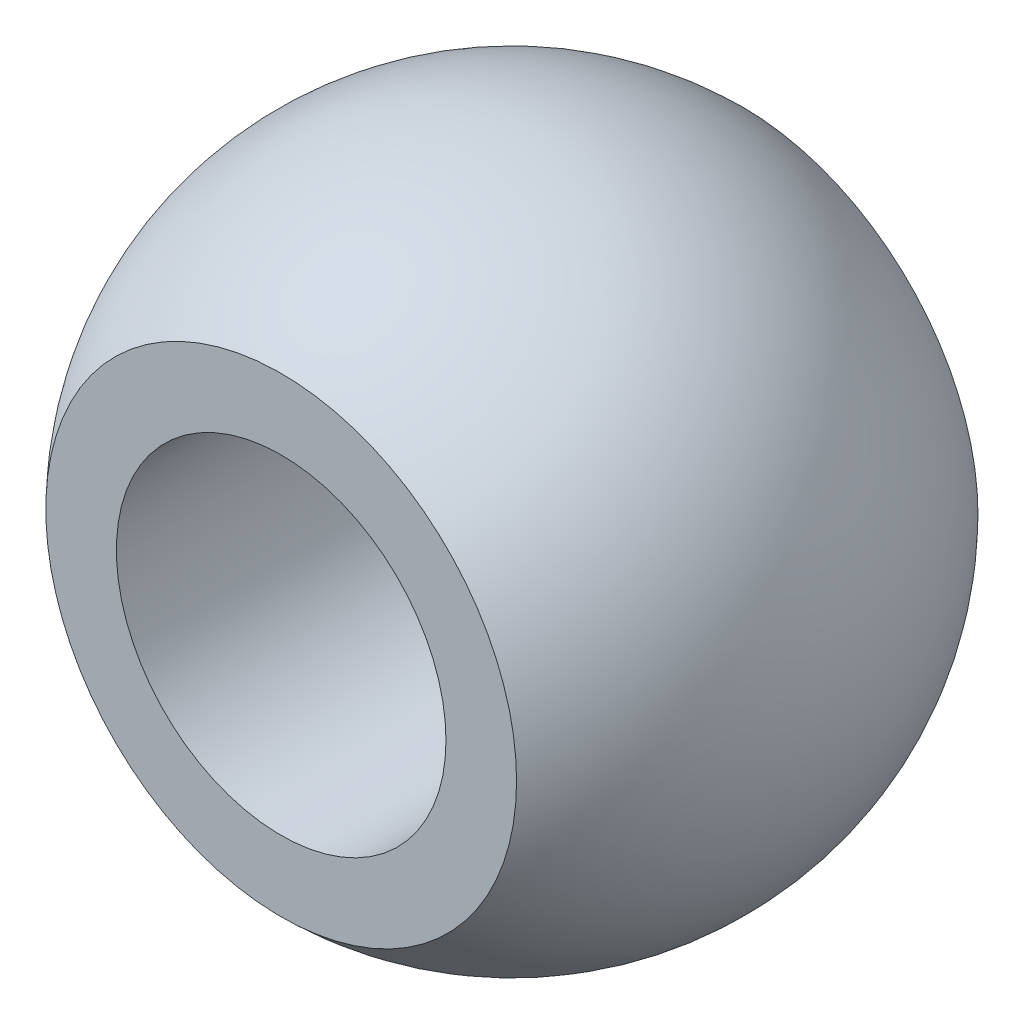
ISO-10303-21;
HEADER;
FILE_DESCRIPTION(('STEP AP214'),'2;1');
FILE_NAME('part.step','',(''),(''),'','','');
FILE_SCHEMA(('AUTOMOTIVE_DESIGN { 1 0 10303 214 1 1 1 1 }'));
ENDSEC;
DATA;
#1=APPLICATION_CONTEXT('core data for automotive mechanical design processes');
#2=APPLICATION_PROTOCOL_DEFINITION('international standard','automotive_design',2000,#1);
#3=PRODUCT_CONTEXT('',#1,'mechanical');
#4=PRODUCT('Part','Part','',(#3));
#5=PRODUCT_RELATED_PRODUCT_CATEGORY('part','',(#4));
#6=PRODUCT_DEFINITION_FORMATION('','',#4);
#7=PRODUCT_DEFINITION_CONTEXT('part definition',#1,'design');
#8=PRODUCT_DEFINITION('design','',#6,#7);
#9=PRODUCT_DEFINITION_SHAPE('','',#8);
#10=(LENGTH_UNIT() NAMED_UNIT(*) SI_UNIT(.MILLI.,.METRE.));
#11=(NAMED_UNIT(*) PLANE_ANGLE_UNIT() SI_UNIT($,.RADIAN.));
#12=(NAMED_UNIT(*) SI_UNIT($,.STERADIAN.) SOLID_ANGLE_UNIT());
#13=UNCERTAINTY_MEASURE_WITH_UNIT(LENGTH_MEASURE(1.E-05),#10,'distance_accuracy_value','');
#14=(GEOMETRIC_REPRESENTATION_CONTEXT(3) GLOBAL_UNCERTAINTY_ASSIGNED_CONTEXT((#13)) GLOBAL_UNIT_ASSIGNED_CONTEXT((#10,
#11,#12)) REPRESENTATION_CONTEXT('',''));
#15=CARTESIAN_POINT('',(0.,0.,0.));
#16=DIRECTION('',(0.,0.,1.));
#17=DIRECTION('',(1.,0.,0.));
#18=AXIS2_PLACEMENT_3D('',#15,#16,#17);
#19=CARTESIAN_POINT('',(0.,0.,0.));
#20=DIRECTION('',(0.,-1.,0.));
#21=DIRECTION('',(-1.,0.,0.));
#22=AXIS2_PLACEMENT_3D('',#19,#20,#21);
#23=SPHERICAL_SURFACE('',#22,7.9375);
#24=CARTESIAN_POINT('',(0.,0.,0.));
#25=DIRECTION('',(0.,0.,1.));
#26=DIRECTION('',(1.,0.,0.));
#27=AXIS2_PLACEMENT_3D('',#24,#25,#26);
#28=SPHERICAL_SURFACE('',#27,7.9375);
#29=CARTESIAN_POINT('',(0.,0.,5.55625));
#30=DIRECTION('',(0.,0.,1.));
#31=DIRECTION('',(1.,0.,0.));
#32=AXIS2_PLACEMENT_3D('',#29,#30,#31);
#33=CIRCLE('',#32,5.66850881515589);
#34=CARTESIAN_POINT('',(5.66850881515589,0.,5.55625));
#35=VERTEX_POINT('',#34);
#36=EDGE_CURVE('E10',#35,#35,#33,.T.);
#37=ORIENTED_EDGE('',*,*,#36,.F.);
#38=EDGE_LOOP('',(#37));
#39=FACE_BOUND('',#38,.T.);
#40=CARTESIAN_POINT('',(0.,0.,-5.55625));
#41=DIRECTION('',(0.,0.,-1.));
#42=DIRECTION('',(-1.,0.,0.));
#43=AXIS2_PLACEMENT_3D('',#40,#41,#42);
#44=CIRCLE('',#43,5.66850881515589);
#45=CARTESIAN_POINT('',(-5.66850881515589,0.,-5.55625));
#46=VERTEX_POINT('',#45);
#47=EDGE_CURVE('E39',#46,#46,#44,.T.);
#48=ORIENTED_EDGE('',*,*,#47,.F.);
#49=EDGE_LOOP('',(#48));
#50=FACE_BOUND('',#49,.T.);
#51=ADVANCED_FACE('F29',(#39,#50),#28,.T.);
#52=CARTESIAN_POINT('',(0.,0.,-25.4));
#53=DIRECTION('',(0.,0.,1.));
#54=DIRECTION('',(1.,0.,0.));
#55=AXIS2_PLACEMENT_3D('',#52,#53,#54);
#56=CYLINDRICAL_SURFACE('',#55,3.96875);
#57=CARTESIAN_POINT('',(0.,0.,5.55625));
#58=DIRECTION('',(0.,0.,1.));
#59=DIRECTION('',(1.,0.,0.));
#60=AXIS2_PLACEMENT_3D('',#57,#58,#59);
#61=CIRCLE('',#60,3.96875);
#62=CARTESIAN_POINT('',(3.96875,0.,5.55625));
#63=VERTEX_POINT('',#62);
#64=EDGE_CURVE('E35',#63,#63,#61,.T.);
#65=ORIENTED_EDGE('',*,*,#64,.T.);
#66=EDGE_LOOP('',(#65));
#67=FACE_BOUND('',#66,.T.);
#68=CARTESIAN_POINT('',(0.,0.,-5.55625));
#69=DIRECTION('',(0.,0.,-1.));
#70=DIRECTION('',(-1.,0.,0.));
#71=AXIS2_PLACEMENT_3D('',#68,#69,#70);
#72=CIRCLE('',#71,3.96875);
#73=CARTESIAN_POINT('',(-3.96875,0.,-5.55625));
#74=VERTEX_POINT('',#73);
#75=EDGE_CURVE('E43',#74,#74,#72,.T.);
#76=ORIENTED_EDGE('',*,*,#75,.T.);
#77=EDGE_LOOP('',(#76));
#78=FACE_BOUND('',#77,.T.);
#79=ADVANCED_FACE('F49',(#67,#78),#56,.F.);
#80=CARTESIAN_POINT('',(0.,0.,5.55625));
#81=DIRECTION('',(0.,0.,1.));
#82=DIRECTION('',(1.,0.,0.));
#83=AXIS2_PLACEMENT_3D('',#80,#81,#82);
#84=PLANE('',#83);
#85=ORIENTED_EDGE('',*,*,#36,.T.);
#86=EDGE_LOOP('',(#85));
#87=FACE_BOUND('',#86,.T.);
#88=ORIENTED_EDGE('',*,*,#64,.F.);
#89=EDGE_LOOP('',(#88));
#90=FACE_BOUND('',#89,.T.);
#91=ADVANCED_FACE('F53',(#87,#90),#84,.T.);
#92=CARTESIAN_POINT('',(0.,0.,-5.55625));
#93=DIRECTION('',(0.,0.,-1.));
#94=DIRECTION('',(1.,0.,0.));
#95=AXIS2_PLACEMENT_3D('',#92,#93,#94);
#96=PLANE('',#95);
#97=ORIENTED_EDGE('',*,*,#47,.T.);
#98=EDGE_LOOP('',(#97));
#99=FACE_BOUND('',#98,.T.);
#100=ORIENTED_EDGE('',*,*,#75,.F.);
#101=EDGE_LOOP('',(#100));
#102=FACE_BOUND('',#101,.T.);
#103=ADVANCED_FACE('F51',(#99,#102),#96,.T.);
#104=CLOSED_SHELL('',(#51,#79,#91,#103));
#105=MANIFOLD_SOLID_BREP('B2',#104);
#106=ADVANCED_BREP_SHAPE_REPRESENTATION('',(#18,#105),#14);
#107=SHAPE_DEFINITION_REPRESENTATION(#9,#106);
ENDSEC;
END-ISO-10303-21;
